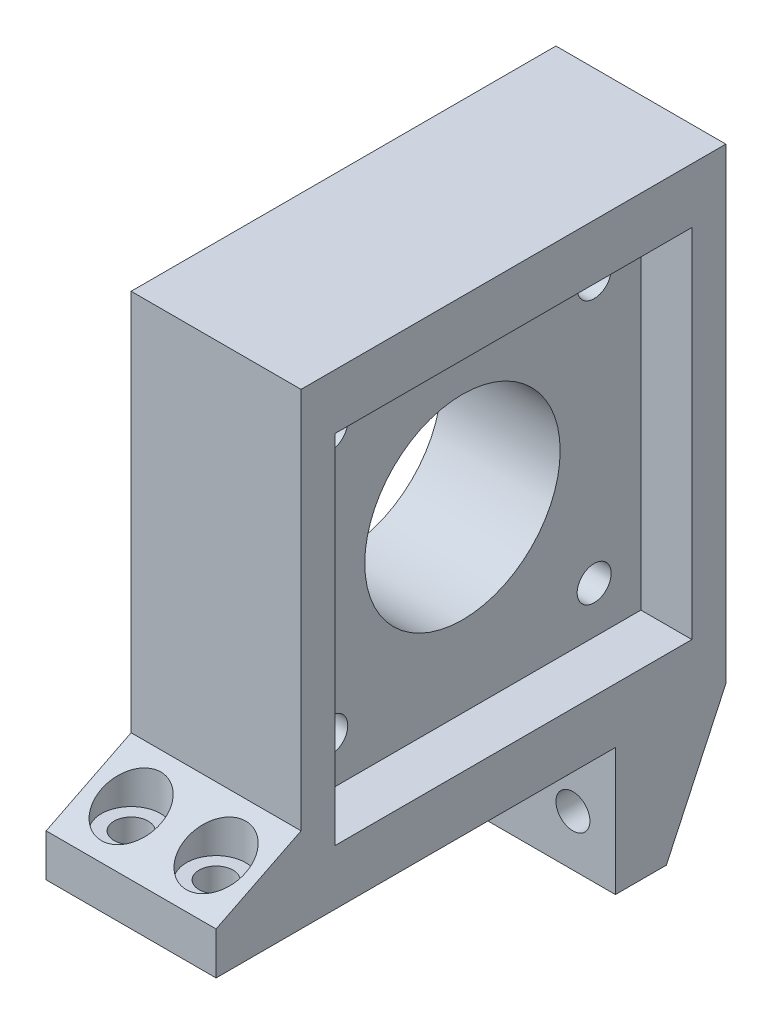
ISO-10303-21;
HEADER;
FILE_DESCRIPTION(('STEP AP214'),'2;1');
FILE_NAME('part.step','',(''),(''),'','','');
FILE_SCHEMA(('AUTOMOTIVE_DESIGN { 1 0 10303 214 1 1 1 1 }'));
ENDSEC;
DATA;
#1=APPLICATION_CONTEXT('core data for automotive mechanical design processes');
#2=APPLICATION_PROTOCOL_DEFINITION('international standard','automotive_design',2000,#1);
#3=PRODUCT_CONTEXT('',#1,'mechanical');
#4=PRODUCT('Part','Part','',(#3));
#5=PRODUCT_RELATED_PRODUCT_CATEGORY('part','',(#4));
#6=PRODUCT_DEFINITION_FORMATION('','',#4);
#7=PRODUCT_DEFINITION_CONTEXT('part definition',#1,'design');
#8=PRODUCT_DEFINITION('design','',#6,#7);
#9=PRODUCT_DEFINITION_SHAPE('','',#8);
#10=(LENGTH_UNIT() NAMED_UNIT(*) SI_UNIT(.MILLI.,.METRE.));
#11=(NAMED_UNIT(*) PLANE_ANGLE_UNIT() SI_UNIT($,.RADIAN.));
#12=(NAMED_UNIT(*) SI_UNIT($,.STERADIAN.) SOLID_ANGLE_UNIT());
#13=UNCERTAINTY_MEASURE_WITH_UNIT(LENGTH_MEASURE(1.E-05),#10,'distance_accuracy_value','');
#14=(GEOMETRIC_REPRESENTATION_CONTEXT(3) GLOBAL_UNCERTAINTY_ASSIGNED_CONTEXT((#13)) GLOBAL_UNIT_ASSIGNED_CONTEXT((#10,
#11,#12)) REPRESENTATION_CONTEXT('',''));
#15=CARTESIAN_POINT('',(0.,0.,0.));
#16=DIRECTION('',(0.,0.,1.));
#17=DIRECTION('',(1.,0.,0.));
#18=AXIS2_PLACEMENT_3D('',#15,#16,#17);
#19=CARTESIAN_POINT('',(-15.,25.,55.));
#20=DIRECTION('',(0.,-1.,0.));
#21=DIRECTION('',(0.,0.,-1.));
#22=AXIS2_PLACEMENT_3D('',#19,#20,#21);
#23=CYLINDRICAL_SURFACE('',#22,2.);
#24=CARTESIAN_POINT('',(-15.,15.,55.));
#25=DIRECTION('',(0.,-1.,0.));
#26=DIRECTION('',(0.,0.,-1.));
#27=AXIS2_PLACEMENT_3D('',#24,#25,#26);
#28=CIRCLE('',#27,2.);
#29=CARTESIAN_POINT('',(-15.,15.,53.));
#30=VERTEX_POINT('',#29);
#31=EDGE_CURVE('E232',#30,#30,#28,.T.);
#32=ORIENTED_EDGE('',*,*,#31,.T.);
#33=EDGE_LOOP('',(#32));
#34=FACE_BOUND('',#33,.T.);
#35=CARTESIAN_POINT('',(-15.,20.,55.));
#36=DIRECTION('',(0.,1.,0.));
#37=DIRECTION('',(0.,0.,1.));
#38=AXIS2_PLACEMENT_3D('',#35,#36,#37);
#39=CIRCLE('',#38,2.);
#40=CARTESIAN_POINT('',(-15.,20.,57.));
#41=VERTEX_POINT('',#40);
#42=EDGE_CURVE('E237',#41,#41,#39,.F.);
#43=ORIENTED_EDGE('',*,*,#42,.F.);
#44=EDGE_LOOP('',(#43));
#45=FACE_BOUND('',#44,.T.);
#46=ADVANCED_FACE('F39',(#34,#45),#23,.F.);
#47=CARTESIAN_POINT('',(-5.,25.,55.));
#48=DIRECTION('',(0.,-1.,0.));
#49=DIRECTION('',(0.,0.,-1.));
#50=AXIS2_PLACEMENT_3D('',#47,#48,#49);
#51=CYLINDRICAL_SURFACE('',#50,2.);
#52=CARTESIAN_POINT('',(-5.,15.,55.));
#53=DIRECTION('',(0.,-1.,0.));
#54=DIRECTION('',(0.,0.,-1.));
#55=AXIS2_PLACEMENT_3D('',#52,#53,#54);
#56=CIRCLE('',#55,2.);
#57=CARTESIAN_POINT('',(-5.,15.,53.));
#58=VERTEX_POINT('',#57);
#59=EDGE_CURVE('E261',#58,#58,#56,.T.);
#60=ORIENTED_EDGE('',*,*,#59,.T.);
#61=EDGE_LOOP('',(#60));
#62=FACE_BOUND('',#61,.T.);
#63=CARTESIAN_POINT('',(-5.,20.,55.));
#64=DIRECTION('',(0.,1.,0.));
#65=DIRECTION('',(0.,0.,1.));
#66=AXIS2_PLACEMENT_3D('',#63,#64,#65);
#67=CIRCLE('',#66,2.);
#68=CARTESIAN_POINT('',(-5.,20.,57.));
#69=VERTEX_POINT('',#68);
#70=EDGE_CURVE('E233',#69,#69,#67,.F.);
#71=ORIENTED_EDGE('',*,*,#70,.F.);
#72=EDGE_LOOP('',(#71));
#73=FACE_BOUND('',#72,.T.);
#74=ADVANCED_FACE('F423',(#62,#73),#51,.F.);
#75=CARTESIAN_POINT('',(-5.,6.,15.));
#76=DIRECTION('',(0.,0.,-1.));
#77=DIRECTION('',(-1.,0.,0.));
#78=AXIS2_PLACEMENT_3D('',#75,#76,#77);
#79=CYLINDRICAL_SURFACE('',#78,2.);
#80=CARTESIAN_POINT('',(-5.,6.,13.));
#81=DIRECTION('',(0.,0.,-1.));
#82=DIRECTION('',(-1.,0.,0.));
#83=AXIS2_PLACEMENT_3D('',#80,#81,#82);
#84=CIRCLE('',#83,2.);
#85=CARTESIAN_POINT('',(-7.,6.,13.));
#86=VERTEX_POINT('',#85);
#87=EDGE_CURVE('E199',#86,#86,#84,.T.);
#88=ORIENTED_EDGE('',*,*,#87,.F.);
#89=EDGE_LOOP('',(#88));
#90=FACE_BOUND('',#89,.T.);
#91=CARTESIAN_POINT('',(-5.,6.,8.));
#92=DIRECTION('',(0.,0.,-1.));
#93=DIRECTION('',(-1.,0.,0.));
#94=AXIS2_PLACEMENT_3D('',#91,#92,#93);
#95=CIRCLE('',#94,2.);
#96=CARTESIAN_POINT('',(-7.,6.,8.));
#97=VERTEX_POINT('',#96);
#98=EDGE_CURVE('E228',#97,#97,#95,.F.);
#99=ORIENTED_EDGE('',*,*,#98,.F.);
#100=EDGE_LOOP('',(#99));
#101=FACE_BOUND('',#100,.T.);
#102=ADVANCED_FACE('F429',(#90,#101),#79,.F.);
#103=CARTESIAN_POINT('',(-15.,6.,15.));
#104=DIRECTION('',(0.,0.,-1.));
#105=DIRECTION('',(-1.,0.,0.));
#106=AXIS2_PLACEMENT_3D('',#103,#104,#105);
#107=CYLINDRICAL_SURFACE('',#106,2.);
#108=CARTESIAN_POINT('',(-15.,6.,13.));
#109=DIRECTION('',(0.,0.,-1.));
#110=DIRECTION('',(-1.,0.,0.));
#111=AXIS2_PLACEMENT_3D('',#108,#109,#110);
#112=CIRCLE('',#111,2.);
#113=CARTESIAN_POINT('',(-17.,6.,13.));
#114=VERTEX_POINT('',#113);
#115=EDGE_CURVE('E203',#114,#114,#112,.T.);
#116=ORIENTED_EDGE('',*,*,#115,.F.);
#117=EDGE_LOOP('',(#116));
#118=FACE_BOUND('',#117,.T.);
#119=CARTESIAN_POINT('',(-15.,6.,8.));
#120=DIRECTION('',(0.,0.,-1.));
#121=DIRECTION('',(-1.,0.,0.));
#122=AXIS2_PLACEMENT_3D('',#119,#120,#121);
#123=CIRCLE('',#122,2.);
#124=CARTESIAN_POINT('',(-17.,6.,8.));
#125=VERTEX_POINT('',#124);
#126=EDGE_CURVE('E224',#125,#125,#123,.F.);
#127=ORIENTED_EDGE('',*,*,#126,.F.);
#128=EDGE_LOOP('',(#127));
#129=FACE_BOUND('',#128,.T.);
#130=ADVANCED_FACE('F543',(#118,#129),#107,.F.);
#131=CARTESIAN_POINT('',(0.,70.,50.));
#132=DIRECTION('',(0.,0.,-1.));
#133=DIRECTION('',(-1.,0.,0.));
#134=AXIS2_PLACEMENT_3D('',#131,#132,#133);
#135=PLANE('',#134);
#136=DIRECTION('',(0.,-1.,0.));
#137=VECTOR('',#136,1.);
#138=CARTESIAN_POINT('',(-20.,70.,50.));
#139=LINE('',#138,#137);
#140=CARTESIAN_POINT('',(-20.,70.,50.));
#141=VERTEX_POINT('',#140);
#142=CARTESIAN_POINT('',(-20.,25.,50.));
#143=VERTEX_POINT('',#142);
#144=EDGE_CURVE('E155',#141,#143,#139,.T.);
#145=ORIENTED_EDGE('',*,*,#144,.T.);
#146=DIRECTION('',(1.,0.,0.));
#147=VECTOR('',#146,1.);
#148=CARTESIAN_POINT('',(-20.,25.,50.));
#149=LINE('',#148,#147);
#150=CARTESIAN_POINT('',(0.,25.,50.));
#151=VERTEX_POINT('',#150);
#152=EDGE_CURVE('E135',#143,#151,#149,.T.);
#153=ORIENTED_EDGE('',*,*,#152,.T.);
#154=DIRECTION('',(0.,-1.,0.));
#155=VECTOR('',#154,1.);
#156=CARTESIAN_POINT('',(0.,70.,50.));
#157=LINE('',#156,#155);
#158=CARTESIAN_POINT('',(0.,70.,50.));
#159=VERTEX_POINT('',#158);
#160=EDGE_CURVE('E165',#159,#151,#157,.T.);
#161=ORIENTED_EDGE('',*,*,#160,.F.);
#162=DIRECTION('',(1.,0.,0.));
#163=VECTOR('',#162,1.);
#164=CARTESIAN_POINT('',(0.,70.,50.));
#165=LINE('',#164,#163);
#166=EDGE_CURVE('E162',#141,#159,#165,.T.);
#167=ORIENTED_EDGE('',*,*,#166,.F.);
#168=EDGE_LOOP('',(#145,#153,#161,#167));
#169=FACE_BOUND('',#168,.T.);
#170=ADVANCED_FACE('F161',(#169),#135,.F.);
#171=CARTESIAN_POINT('',(0.,70.,0.));
#172=DIRECTION('',(-1.,0.,0.));
#173=DIRECTION('',(0.,0.,1.));
#174=AXIS2_PLACEMENT_3D('',#171,#172,#173);
#175=PLANE('',#174);
#176=ORIENTED_EDGE('',*,*,#160,.T.);
#177=DIRECTION('',(0.,-0.447213595499958,0.894427190999916));
#178=VECTOR('',#177,1.);
#179=CARTESIAN_POINT('',(0.,20.,60.));
#180=LINE('',#179,#178);
#181=CARTESIAN_POINT('',(0.,20.,60.));
#182=VERTEX_POINT('',#181);
#183=EDGE_CURVE('E141',#151,#182,#180,.T.);
#184=ORIENTED_EDGE('',*,*,#183,.T.);
#185=DIRECTION('',(0.,1.,0.));
#186=VECTOR('',#185,1.);
#187=CARTESIAN_POINT('',(0.,15.,60.));
#188=LINE('',#187,#186);
#189=CARTESIAN_POINT('',(0.,15.,60.));
#190=VERTEX_POINT('',#189);
#191=EDGE_CURVE('E147',#190,#182,#188,.T.);
#192=ORIENTED_EDGE('',*,*,#191,.F.);
#193=DIRECTION('',(0.,0.,1.));
#194=VECTOR('',#193,1.);
#195=CARTESIAN_POINT('',(0.,15.,50.));
#196=LINE('',#195,#194);
#197=CARTESIAN_POINT('',(0.,15.,13.));
#198=VERTEX_POINT('',#197);
#199=EDGE_CURVE('E352',#198,#190,#196,.T.);
#200=ORIENTED_EDGE('',*,*,#199,.F.);
#201=DIRECTION('',(0.,1.,0.));
#202=VECTOR('',#201,1.);
#203=CARTESIAN_POINT('',(0.,0.,13.));
#204=LINE('',#203,#202);
#205=CARTESIAN_POINT('',(0.,0.,13.));
#206=VERTEX_POINT('',#205);
#207=EDGE_CURVE('E208',#206,#198,#204,.T.);
#208=ORIENTED_EDGE('',*,*,#207,.F.);
#209=DIRECTION('',(0.,0.,-1.));
#210=VECTOR('',#209,1.);
#211=CARTESIAN_POINT('',(0.,0.,0.));
#212=LINE('',#211,#210);
#213=CARTESIAN_POINT('',(0.,0.,7.));
#214=VERTEX_POINT('',#213);
#215=EDGE_CURVE('E197',#206,#214,#212,.T.);
#216=ORIENTED_EDGE('',*,*,#215,.T.);
#217=DIRECTION('',(0.,-0.906183139995266,0.422885465331124));
#218=VECTOR('',#217,1.);
#219=CARTESIAN_POINT('',(0.,15.,0.));
#220=LINE('',#219,#218);
#221=CARTESIAN_POINT('',(0.,15.,0.));
#222=VERTEX_POINT('',#221);
#223=EDGE_CURVE('E57',#222,#214,#220,.T.);
#224=ORIENTED_EDGE('',*,*,#223,.F.);
#225=DIRECTION('',(0.,-1.,0.));
#226=VECTOR('',#225,1.);
#227=CARTESIAN_POINT('',(0.,70.,0.));
#228=LINE('',#227,#226);
#229=CARTESIAN_POINT('',(0.,70.,0.));
#230=VERTEX_POINT('',#229);
#231=EDGE_CURVE('E49',#230,#222,#228,.T.);
#232=ORIENTED_EDGE('',*,*,#231,.F.);
#233=DIRECTION('',(0.,0.,-1.));
#234=VECTOR('',#233,1.);
#235=CARTESIAN_POINT('',(0.,70.,0.));
#236=LINE('',#235,#234);
#237=EDGE_CURVE('E364',#159,#230,#236,.T.);
#238=ORIENTED_EDGE('',*,*,#237,.F.);
#239=EDGE_LOOP('',(#176,#184,#192,#200,#208,#216,#224,#232,#238));
#240=FACE_BOUND('',#239,.T.);
#241=DIRECTION('',(0.,0.,1.));
#242=VECTOR('',#241,1.);
#243=CARTESIAN_POINT('',(0.,63.5,4.));
#244=LINE('',#243,#242);
#245=CARTESIAN_POINT('',(0.,63.5,4.));
#246=VERTEX_POINT('',#245);
#247=CARTESIAN_POINT('',(0.,63.5,46.));
#248=VERTEX_POINT('',#247);
#249=EDGE_CURVE('E314',#246,#248,#244,.T.);
#250=ORIENTED_EDGE('',*,*,#249,.F.);
#251=DIRECTION('',(0.,1.,0.));
#252=VECTOR('',#251,1.);
#253=CARTESIAN_POINT('',(0.,63.5,4.));
#254=LINE('',#253,#252);
#255=CARTESIAN_POINT('',(0.,21.5,3.99999999999999));
#256=VERTEX_POINT('',#255);
#257=EDGE_CURVE('E65',#256,#246,#254,.T.);
#258=ORIENTED_EDGE('',*,*,#257,.F.);
#259=DIRECTION('',(0.,0.,-1.));
#260=VECTOR('',#259,1.);
#261=CARTESIAN_POINT('',(0.,21.5,3.99999999999999));
#262=LINE('',#261,#260);
#263=CARTESIAN_POINT('',(0.,21.5,46.));
#264=VERTEX_POINT('',#263);
#265=EDGE_CURVE('E299',#264,#256,#262,.T.);
#266=ORIENTED_EDGE('',*,*,#265,.F.);
#267=DIRECTION('',(0.,-1.,0.));
#268=VECTOR('',#267,1.);
#269=CARTESIAN_POINT('',(0.,63.5,46.));
#270=LINE('',#269,#268);
#271=EDGE_CURVE('E318',#248,#264,#270,.T.);
#272=ORIENTED_EDGE('',*,*,#271,.F.);
#273=EDGE_LOOP('',(#250,#258,#266,#272));
#274=FACE_BOUND('',#273,.T.);
#275=ADVANCED_FACE('F41',(#240,#274),#175,.F.);
#276=CARTESIAN_POINT('',(0.,70.,0.));
#277=DIRECTION('',(0.,0.,1.));
#278=DIRECTION('',(1.,0.,0.));
#279=AXIS2_PLACEMENT_3D('',#276,#277,#278);
#280=PLANE('',#279);
#281=ORIENTED_EDGE('',*,*,#231,.T.);
#282=DIRECTION('',(1.,0.,0.));
#283=VECTOR('',#282,1.);
#284=CARTESIAN_POINT('',(-30.,15.,0.));
#285=LINE('',#284,#283);
#286=CARTESIAN_POINT('',(-20.,15.,0.));
#287=VERTEX_POINT('',#286);
#288=EDGE_CURVE('E285',#287,#222,#285,.T.);
#289=ORIENTED_EDGE('',*,*,#288,.F.);
#290=DIRECTION('',(0.,-1.,0.));
#291=VECTOR('',#290,1.);
#292=CARTESIAN_POINT('',(-20.,70.,0.));
#293=LINE('',#292,#291);
#294=CARTESIAN_POINT('',(-20.,70.,0.));
#295=VERTEX_POINT('',#294);
#296=EDGE_CURVE('E164',#295,#287,#293,.T.);
#297=ORIENTED_EDGE('',*,*,#296,.F.);
#298=DIRECTION('',(-1.,0.,0.));
#299=VECTOR('',#298,1.);
#300=CARTESIAN_POINT('',(0.,70.,0.));
#301=LINE('',#300,#299);
#302=EDGE_CURVE('E368',#230,#295,#301,.T.);
#303=ORIENTED_EDGE('',*,*,#302,.F.);
#304=EDGE_LOOP('',(#281,#289,#297,#303));
#305=FACE_BOUND('',#304,.T.);
#306=ADVANCED_FACE('F406',(#305),#280,.F.);
#307=CARTESIAN_POINT('',(-20.,70.,0.));
#308=DIRECTION('',(1.,0.,0.));
#309=DIRECTION('',(0.,0.,-1.));
#310=AXIS2_PLACEMENT_3D('',#307,#308,#309);
#311=PLANE('',#310);
#312=DIRECTION('',(0.,-0.447213595499958,0.894427190999916));
#313=VECTOR('',#312,1.);
#314=CARTESIAN_POINT('',(-20.,20.,60.));
#315=LINE('',#314,#313);
#316=CARTESIAN_POINT('',(-20.,20.,60.));
#317=VERTEX_POINT('',#316);
#318=EDGE_CURVE('E138',#143,#317,#315,.T.);
#319=ORIENTED_EDGE('',*,*,#318,.F.);
#320=ORIENTED_EDGE('',*,*,#144,.F.);
#321=DIRECTION('',(0.,0.,1.));
#322=VECTOR('',#321,1.);
#323=CARTESIAN_POINT('',(-20.,70.,0.));
#324=LINE('',#323,#322);
#325=EDGE_CURVE('E372',#295,#141,#324,.T.);
#326=ORIENTED_EDGE('',*,*,#325,.F.);
#327=ORIENTED_EDGE('',*,*,#296,.T.);
#328=DIRECTION('',(0.,-0.906183139995266,0.422885465331124));
#329=VECTOR('',#328,1.);
#330=CARTESIAN_POINT('',(-20.,60.1642335766424,-21.0766423357664));
#331=LINE('',#330,#329);
#332=CARTESIAN_POINT('',(-20.,0.,7.));
#333=VERTEX_POINT('',#332);
#334=EDGE_CURVE('E288',#287,#333,#331,.T.);
#335=ORIENTED_EDGE('',*,*,#334,.T.);
#336=DIRECTION('',(0.,0.,1.));
#337=VECTOR('',#336,1.);
#338=CARTESIAN_POINT('',(-20.,0.,0.));
#339=LINE('',#338,#337);
#340=CARTESIAN_POINT('',(-20.,0.,13.));
#341=VERTEX_POINT('',#340);
#342=EDGE_CURVE('E369',#333,#341,#339,.T.);
#343=ORIENTED_EDGE('',*,*,#342,.T.);
#344=DIRECTION('',(0.,1.,0.));
#345=VECTOR('',#344,1.);
#346=CARTESIAN_POINT('',(-20.,70.,13.));
#347=LINE('',#346,#345);
#348=CARTESIAN_POINT('',(-20.,15.,13.));
#349=VERTEX_POINT('',#348);
#350=EDGE_CURVE('E358',#341,#349,#347,.T.);
#351=ORIENTED_EDGE('',*,*,#350,.T.);
#352=DIRECTION('',(0.,0.,1.));
#353=VECTOR('',#352,1.);
#354=CARTESIAN_POINT('',(-20.,15.,0.));
#355=LINE('',#354,#353);
#356=CARTESIAN_POINT('',(-20.,15.,60.));
#357=VERTEX_POINT('',#356);
#358=EDGE_CURVE('E182',#349,#357,#355,.T.);
#359=ORIENTED_EDGE('',*,*,#358,.T.);
#360=DIRECTION('',(0.,-1.,0.));
#361=VECTOR('',#360,1.);
#362=CARTESIAN_POINT('',(-20.,15.,60.));
#363=LINE('',#362,#361);
#364=EDGE_CURVE('E158',#317,#357,#363,.T.);
#365=ORIENTED_EDGE('',*,*,#364,.F.);
#366=EDGE_LOOP('',(#319,#320,#326,#327,#335,#343,#351,#359,#365));
#367=FACE_BOUND('',#366,.T.);
#368=CARTESIAN_POINT('',(-20.,42.5,25.));
#369=DIRECTION('',(1.,0.,0.));
#370=DIRECTION('',(0.,0.,-1.));
#371=AXIS2_PLACEMENT_3D('',#368,#369,#370);
#372=CIRCLE('',#371,11.5);
#373=CARTESIAN_POINT('',(-20.,42.5,13.5));
#374=VERTEX_POINT('',#373);
#375=EDGE_CURVE('E194',#374,#374,#372,.T.);
#376=ORIENTED_EDGE('',*,*,#375,.T.);
#377=EDGE_LOOP('',(#376));
#378=FACE_BOUND('',#377,.T.);
#379=CARTESIAN_POINT('',(-20.,58.,40.5));
#380=DIRECTION('',(1.,0.,0.));
#381=DIRECTION('',(0.,0.,-1.));
#382=AXIS2_PLACEMENT_3D('',#379,#380,#381);
#383=CIRCLE('',#382,2.00000000000001);
#384=CARTESIAN_POINT('',(-20.,58.,38.5));
#385=VERTEX_POINT('',#384);
#386=EDGE_CURVE('E190',#385,#385,#383,.T.);
#387=ORIENTED_EDGE('',*,*,#386,.T.);
#388=EDGE_LOOP('',(#387));
#389=FACE_BOUND('',#388,.T.);
#390=CARTESIAN_POINT('',(-20.,27.,40.5));
#391=DIRECTION('',(1.,0.,0.));
#392=DIRECTION('',(0.,0.,-1.));
#393=AXIS2_PLACEMENT_3D('',#390,#391,#392);
#394=CIRCLE('',#393,2.);
#395=CARTESIAN_POINT('',(-20.,27.,38.5));
#396=VERTEX_POINT('',#395);
#397=EDGE_CURVE('E186',#396,#396,#394,.T.);
#398=ORIENTED_EDGE('',*,*,#397,.T.);
#399=EDGE_LOOP('',(#398));
#400=FACE_BOUND('',#399,.T.);
#401=CARTESIAN_POINT('',(-20.,27.,9.5));
#402=DIRECTION('',(1.,0.,0.));
#403=DIRECTION('',(0.,0.,-1.));
#404=AXIS2_PLACEMENT_3D('',#401,#402,#403);
#405=CIRCLE('',#404,2.00000000000001);
#406=CARTESIAN_POINT('',(-20.,27.,7.49999999999999));
#407=VERTEX_POINT('',#406);
#408=EDGE_CURVE('E181',#407,#407,#405,.T.);
#409=ORIENTED_EDGE('',*,*,#408,.T.);
#410=EDGE_LOOP('',(#409));
#411=FACE_BOUND('',#410,.T.);
#412=CARTESIAN_POINT('',(-20.,58.,9.5));
#413=DIRECTION('',(1.,0.,0.));
#414=DIRECTION('',(0.,0.,-1.));
#415=AXIS2_PLACEMENT_3D('',#412,#413,#414);
#416=CIRCLE('',#415,2.00000000000001);
#417=CARTESIAN_POINT('',(-20.,58.,7.5));
#418=VERTEX_POINT('',#417);
#419=EDGE_CURVE('E177',#418,#418,#416,.T.);
#420=ORIENTED_EDGE('',*,*,#419,.T.);
#421=EDGE_LOOP('',(#420));
#422=FACE_BOUND('',#421,.T.);
#423=ADVANCED_FACE('F152',(#367,#378,#389,#400,#411,#422),#311,.F.);
#424=CARTESIAN_POINT('',(0.,70.,0.));
#425=DIRECTION('',(0.,-1.,0.));
#426=DIRECTION('',(0.,0.,-1.));
#427=AXIS2_PLACEMENT_3D('',#424,#425,#426);
#428=PLANE('',#427);
#429=ORIENTED_EDGE('',*,*,#237,.T.);
#430=ORIENTED_EDGE('',*,*,#302,.T.);
#431=ORIENTED_EDGE('',*,*,#325,.T.);
#432=ORIENTED_EDGE('',*,*,#166,.T.);
#433=EDGE_LOOP('',(#429,#430,#431,#432));
#434=FACE_BOUND('',#433,.T.);
#435=ADVANCED_FACE('F402',(#434),#428,.F.);
#436=CARTESIAN_POINT('',(0.,0.,0.));
#437=DIRECTION('',(0.,-1.,0.));
#438=DIRECTION('',(0.,0.,-1.));
#439=AXIS2_PLACEMENT_3D('',#436,#437,#438);
#440=PLANE('',#439);
#441=DIRECTION('',(1.,0.,0.));
#442=VECTOR('',#441,1.);
#443=CARTESIAN_POINT('',(-30.,0.,7.));
#444=LINE('',#443,#442);
#445=EDGE_CURVE('E284',#333,#214,#444,.T.);
#446=ORIENTED_EDGE('',*,*,#445,.T.);
#447=ORIENTED_EDGE('',*,*,#215,.F.);
#448=DIRECTION('',(1.,0.,0.));
#449=VECTOR('',#448,1.);
#450=CARTESIAN_POINT('',(0.,0.,13.));
#451=LINE('',#450,#449);
#452=EDGE_CURVE('E11',#341,#206,#451,.T.);
#453=ORIENTED_EDGE('',*,*,#452,.F.);
#454=ORIENTED_EDGE('',*,*,#342,.F.);
#455=EDGE_LOOP('',(#446,#447,#453,#454));
#456=FACE_BOUND('',#455,.T.);
#457=ADVANCED_FACE('F389',(#456),#440,.T.);
#458=CARTESIAN_POINT('',(-60.,58.,9.50000000000001));
#459=DIRECTION('',(1.,0.,0.));
#460=DIRECTION('',(0.,0.,-1.));
#461=AXIS2_PLACEMENT_3D('',#458,#459,#460);
#462=CYLINDRICAL_SURFACE('',#461,2.00000000000001);
#463=CARTESIAN_POINT('',(-6.,58.,9.5));
#464=DIRECTION('',(-1.,0.,0.));
#465=DIRECTION('',(0.,0.,1.));
#466=AXIS2_PLACEMENT_3D('',#463,#464,#465);
#467=CIRCLE('',#466,2.00000000000001);
#468=CARTESIAN_POINT('',(-6.,58.,11.5));
#469=VERTEX_POINT('',#468);
#470=EDGE_CURVE('E204',#469,#469,#467,.F.);
#471=ORIENTED_EDGE('',*,*,#470,.T.);
#472=EDGE_LOOP('',(#471));
#473=FACE_BOUND('',#472,.T.);
#474=ORIENTED_EDGE('',*,*,#419,.F.);
#475=EDGE_LOOP('',(#474));
#476=FACE_BOUND('',#475,.T.);
#477=ADVANCED_FACE('F660',(#473,#476),#462,.F.);
#478=CARTESIAN_POINT('',(-60.,27.,9.50000000000001));
#479=DIRECTION('',(1.,0.,0.));
#480=DIRECTION('',(0.,0.,-1.));
#481=AXIS2_PLACEMENT_3D('',#478,#479,#480);
#482=CYLINDRICAL_SURFACE('',#481,2.00000000000001);
#483=CARTESIAN_POINT('',(-6.,27.,9.5));
#484=DIRECTION('',(-1.,0.,0.));
#485=DIRECTION('',(0.,0.,1.));
#486=AXIS2_PLACEMENT_3D('',#483,#484,#485);
#487=CIRCLE('',#486,2.00000000000001);
#488=CARTESIAN_POINT('',(-6.,27.,11.5));
#489=VERTEX_POINT('',#488);
#490=EDGE_CURVE('E342',#489,#489,#487,.F.);
#491=ORIENTED_EDGE('',*,*,#490,.T.);
#492=EDGE_LOOP('',(#491));
#493=FACE_BOUND('',#492,.T.);
#494=ORIENTED_EDGE('',*,*,#408,.F.);
#495=EDGE_LOOP('',(#494));
#496=FACE_BOUND('',#495,.T.);
#497=ADVANCED_FACE('F685',(#493,#496),#482,.F.);
#498=CARTESIAN_POINT('',(-60.,27.,40.5));
#499=DIRECTION('',(1.,0.,0.));
#500=DIRECTION('',(0.,0.,-1.));
#501=AXIS2_PLACEMENT_3D('',#498,#499,#500);
#502=CYLINDRICAL_SURFACE('',#501,2.);
#503=CARTESIAN_POINT('',(-5.99999999999999,27.,40.5));
#504=DIRECTION('',(-1.,0.,0.));
#505=DIRECTION('',(0.,0.,1.));
#506=AXIS2_PLACEMENT_3D('',#503,#504,#505);
#507=CIRCLE('',#506,2.);
#508=CARTESIAN_POINT('',(-5.99999999999999,27.,42.5));
#509=VERTEX_POINT('',#508);
#510=EDGE_CURVE('E338',#509,#509,#507,.F.);
#511=ORIENTED_EDGE('',*,*,#510,.T.);
#512=EDGE_LOOP('',(#511));
#513=FACE_BOUND('',#512,.T.);
#514=ORIENTED_EDGE('',*,*,#397,.F.);
#515=EDGE_LOOP('',(#514));
#516=FACE_BOUND('',#515,.T.);
#517=ADVANCED_FACE('F691',(#513,#516),#502,.F.);
#518=CARTESIAN_POINT('',(-60.,58.,40.5));
#519=DIRECTION('',(1.,0.,0.));
#520=DIRECTION('',(0.,0.,-1.));
#521=AXIS2_PLACEMENT_3D('',#518,#519,#520);
#522=CYLINDRICAL_SURFACE('',#521,2.00000000000001);
#523=CARTESIAN_POINT('',(-5.99999999999999,58.,40.5));
#524=DIRECTION('',(-1.,0.,0.));
#525=DIRECTION('',(0.,0.,1.));
#526=AXIS2_PLACEMENT_3D('',#523,#524,#525);
#527=CIRCLE('',#526,2.00000000000001);
#528=CARTESIAN_POINT('',(-5.99999999999999,58.,42.5));
#529=VERTEX_POINT('',#528);
#530=EDGE_CURVE('E213',#529,#529,#527,.F.);
#531=ORIENTED_EDGE('',*,*,#530,.T.);
#532=EDGE_LOOP('',(#531));
#533=FACE_BOUND('',#532,.T.);
#534=ORIENTED_EDGE('',*,*,#386,.F.);
#535=EDGE_LOOP('',(#534));
#536=FACE_BOUND('',#535,.T.);
#537=ADVANCED_FACE('F688',(#533,#536),#522,.F.);
#538=CARTESIAN_POINT('',(-60.,42.5,25.));
#539=DIRECTION('',(1.,0.,0.));
#540=DIRECTION('',(0.,0.,-1.));
#541=AXIS2_PLACEMENT_3D('',#538,#539,#540);
#542=CYLINDRICAL_SURFACE('',#541,11.5);
#543=CARTESIAN_POINT('',(-6.,42.5,25.));
#544=DIRECTION('',(-1.,0.,0.));
#545=DIRECTION('',(0.,0.,1.));
#546=AXIS2_PLACEMENT_3D('',#543,#544,#545);
#547=CIRCLE('',#546,11.5);
#548=CARTESIAN_POINT('',(-6.,42.5,36.5));
#549=VERTEX_POINT('',#548);
#550=EDGE_CURVE('E209',#549,#549,#547,.F.);
#551=ORIENTED_EDGE('',*,*,#550,.T.);
#552=EDGE_LOOP('',(#551));
#553=FACE_BOUND('',#552,.T.);
#554=ORIENTED_EDGE('',*,*,#375,.F.);
#555=EDGE_LOOP('',(#554));
#556=FACE_BOUND('',#555,.T.);
#557=ADVANCED_FACE('F592',(#553,#556),#542,.F.);
#558=CARTESIAN_POINT('',(-60.,15.,50.));
#559=DIRECTION('',(0.,1.,0.));
#560=DIRECTION('',(0.,0.,1.));
#561=AXIS2_PLACEMENT_3D('',#558,#559,#560);
#562=PLANE('',#561);
#563=ORIENTED_EDGE('',*,*,#59,.F.);
#564=EDGE_LOOP('',(#563));
#565=FACE_BOUND('',#564,.T.);
#566=ORIENTED_EDGE('',*,*,#31,.F.);
#567=EDGE_LOOP('',(#566));
#568=FACE_BOUND('',#567,.T.);
#569=DIRECTION('',(1.,0.,0.));
#570=VECTOR('',#569,1.);
#571=CARTESIAN_POINT('',(-60.,15.,13.));
#572=LINE('',#571,#570);
#573=EDGE_CURVE('E355',#349,#198,#572,.T.);
#574=ORIENTED_EDGE('',*,*,#573,.T.);
#575=ORIENTED_EDGE('',*,*,#199,.T.);
#576=DIRECTION('',(1.,0.,0.));
#577=VECTOR('',#576,1.);
#578=CARTESIAN_POINT('',(0.,15.,60.));
#579=LINE('',#578,#577);
#580=EDGE_CURVE('E278',#357,#190,#579,.T.);
#581=ORIENTED_EDGE('',*,*,#580,.F.);
#582=ORIENTED_EDGE('',*,*,#358,.F.);
#583=EDGE_LOOP('',(#574,#575,#581,#582));
#584=FACE_BOUND('',#583,.T.);
#585=ADVANCED_FACE('F397',(#565,#568,#584),#562,.F.);
#586=CARTESIAN_POINT('',(-60.,0.,13.));
#587=DIRECTION('',(0.,0.,-1.));
#588=DIRECTION('',(-1.,0.,0.));
#589=AXIS2_PLACEMENT_3D('',#586,#587,#588);
#590=PLANE('',#589);
#591=ORIENTED_EDGE('',*,*,#115,.T.);
#592=EDGE_LOOP('',(#591));
#593=FACE_BOUND('',#592,.T.);
#594=ORIENTED_EDGE('',*,*,#87,.T.);
#595=EDGE_LOOP('',(#594));
#596=FACE_BOUND('',#595,.T.);
#597=ORIENTED_EDGE('',*,*,#452,.T.);
#598=ORIENTED_EDGE('',*,*,#207,.T.);
#599=ORIENTED_EDGE('',*,*,#573,.F.);
#600=ORIENTED_EDGE('',*,*,#350,.F.);
#601=EDGE_LOOP('',(#597,#598,#599,#600));
#602=FACE_BOUND('',#601,.T.);
#603=ADVANCED_FACE('F386',(#593,#596,#602),#590,.F.);
#604=CARTESIAN_POINT('',(-6.,0.,0.));
#605=DIRECTION('',(-1.,0.,0.));
#606=DIRECTION('',(0.,0.,1.));
#607=AXIS2_PLACEMENT_3D('',#604,#605,#606);
#608=PLANE('',#607);
#609=ORIENTED_EDGE('',*,*,#490,.F.);
#610=EDGE_LOOP('',(#609));
#611=FACE_BOUND('',#610,.T.);
#612=ORIENTED_EDGE('',*,*,#530,.F.);
#613=EDGE_LOOP('',(#612));
#614=FACE_BOUND('',#613,.T.);
#615=DIRECTION('',(0.,1.,0.));
#616=VECTOR('',#615,1.);
#617=CARTESIAN_POINT('',(-6.,63.5,4.));
#618=LINE('',#617,#616);
#619=CARTESIAN_POINT('',(-6.,21.5,3.99999999999999));
#620=VERTEX_POINT('',#619);
#621=CARTESIAN_POINT('',(-6.,63.5,4.));
#622=VERTEX_POINT('',#621);
#623=EDGE_CURVE('E294',#620,#622,#618,.T.);
#624=ORIENTED_EDGE('',*,*,#623,.T.);
#625=DIRECTION('',(0.,0.,1.));
#626=VECTOR('',#625,1.);
#627=CARTESIAN_POINT('',(-6.,63.5,4.));
#628=LINE('',#627,#626);
#629=CARTESIAN_POINT('',(-5.99999999999999,63.5,46.));
#630=VERTEX_POINT('',#629);
#631=EDGE_CURVE('E298',#622,#630,#628,.T.);
#632=ORIENTED_EDGE('',*,*,#631,.T.);
#633=DIRECTION('',(0.,-1.,0.));
#634=VECTOR('',#633,1.);
#635=CARTESIAN_POINT('',(-5.99999999999999,63.5,46.));
#636=LINE('',#635,#634);
#637=CARTESIAN_POINT('',(-5.99999999999999,21.5,46.));
#638=VERTEX_POINT('',#637);
#639=EDGE_CURVE('E303',#630,#638,#636,.T.);
#640=ORIENTED_EDGE('',*,*,#639,.T.);
#641=DIRECTION('',(0.,0.,-1.));
#642=VECTOR('',#641,1.);
#643=CARTESIAN_POINT('',(-6.,21.5,3.99999999999999));
#644=LINE('',#643,#642);
#645=EDGE_CURVE('E307',#638,#620,#644,.T.);
#646=ORIENTED_EDGE('',*,*,#645,.T.);
#647=EDGE_LOOP('',(#624,#632,#640,#646));
#648=FACE_BOUND('',#647,.T.);
#649=ORIENTED_EDGE('',*,*,#550,.F.);
#650=EDGE_LOOP('',(#649));
#651=FACE_BOUND('',#650,.T.);
#652=ORIENTED_EDGE('',*,*,#510,.F.);
#653=EDGE_LOOP('',(#652));
#654=FACE_BOUND('',#653,.T.);
#655=ORIENTED_EDGE('',*,*,#470,.F.);
#656=EDGE_LOOP('',(#655));
#657=FACE_BOUND('',#656,.T.);
#658=ADVANCED_FACE('F609',(#611,#614,#648,#651,#654,#657),#608,.F.);
#659=CARTESIAN_POINT('',(-6.,63.5,4.));
#660=DIRECTION('',(0.,0.,-1.));
#661=DIRECTION('',(0.,1.,0.));
#662=AXIS2_PLACEMENT_3D('',#659,#660,#661);
#663=PLANE('',#662);
#664=ORIENTED_EDGE('',*,*,#257,.T.);
#665=DIRECTION('',(1.,0.,0.));
#666=VECTOR('',#665,1.);
#667=CARTESIAN_POINT('',(-6.,63.5,4.));
#668=LINE('',#667,#666);
#669=EDGE_CURVE('E311',#622,#246,#668,.T.);
#670=ORIENTED_EDGE('',*,*,#669,.F.);
#671=ORIENTED_EDGE('',*,*,#623,.F.);
#672=DIRECTION('',(1.,0.,0.));
#673=VECTOR('',#672,1.);
#674=CARTESIAN_POINT('',(-6.,21.5,3.99999999999999));
#675=LINE('',#674,#673);
#676=EDGE_CURVE('E214',#620,#256,#675,.T.);
#677=ORIENTED_EDGE('',*,*,#676,.T.);
#678=EDGE_LOOP('',(#664,#670,#671,#677));
#679=FACE_BOUND('',#678,.T.);
#680=ADVANCED_FACE('F618',(#679),#663,.F.);
#681=CARTESIAN_POINT('',(-6.,21.5,3.99999999999999));
#682=DIRECTION('',(0.,-1.,0.));
#683=DIRECTION('',(0.,0.,-1.));
#684=AXIS2_PLACEMENT_3D('',#681,#682,#683);
#685=PLANE('',#684);
#686=ORIENTED_EDGE('',*,*,#265,.T.);
#687=ORIENTED_EDGE('',*,*,#676,.F.);
#688=ORIENTED_EDGE('',*,*,#645,.F.);
#689=DIRECTION('',(1.,0.,0.));
#690=VECTOR('',#689,1.);
#691=CARTESIAN_POINT('',(-5.99999999999999,21.5,46.));
#692=LINE('',#691,#690);
#693=EDGE_CURVE('E327',#638,#264,#692,.T.);
#694=ORIENTED_EDGE('',*,*,#693,.T.);
#695=EDGE_LOOP('',(#686,#687,#688,#694));
#696=FACE_BOUND('',#695,.T.);
#697=ADVANCED_FACE('F625',(#696),#685,.F.);
#698=CARTESIAN_POINT('',(-5.99999999999999,63.5,46.));
#699=DIRECTION('',(0.,0.,1.));
#700=DIRECTION('',(0.,-1.,0.));
#701=AXIS2_PLACEMENT_3D('',#698,#699,#700);
#702=PLANE('',#701);
#703=ORIENTED_EDGE('',*,*,#271,.T.);
#704=ORIENTED_EDGE('',*,*,#693,.F.);
#705=ORIENTED_EDGE('',*,*,#639,.F.);
#706=DIRECTION('',(1.,0.,0.));
#707=VECTOR('',#706,1.);
#708=CARTESIAN_POINT('',(-5.99999999999999,63.5,46.));
#709=LINE('',#708,#707);
#710=EDGE_CURVE('E330',#630,#248,#709,.T.);
#711=ORIENTED_EDGE('',*,*,#710,.T.);
#712=EDGE_LOOP('',(#703,#704,#705,#711));
#713=FACE_BOUND('',#712,.T.);
#714=ADVANCED_FACE('F417',(#713),#702,.F.);
#715=CARTESIAN_POINT('',(-6.,63.5,4.));
#716=DIRECTION('',(0.,1.,0.));
#717=DIRECTION('',(0.,0.,1.));
#718=AXIS2_PLACEMENT_3D('',#715,#716,#717);
#719=PLANE('',#718);
#720=ORIENTED_EDGE('',*,*,#249,.T.);
#721=ORIENTED_EDGE('',*,*,#710,.F.);
#722=ORIENTED_EDGE('',*,*,#631,.F.);
#723=ORIENTED_EDGE('',*,*,#669,.T.);
#724=EDGE_LOOP('',(#720,#721,#722,#723));
#725=FACE_BOUND('',#724,.T.);
#726=ADVANCED_FACE('F409',(#725),#719,.F.);
#727=CARTESIAN_POINT('',(-30.,15.,0.));
#728=DIRECTION('',(0.,0.422885465331124,0.906183139995266));
#729=DIRECTION('',(0.,-0.906183139995266,0.422885465331124));
#730=AXIS2_PLACEMENT_3D('',#727,#728,#729);
#731=PLANE('',#730);
#732=CARTESIAN_POINT('',(-15.,6.,4.2));
#733=DIRECTION('',(0.,0.422885465331124,0.906183139995266));
#734=DIRECTION('',(0.,0.906183139995266,-0.422885465331124));
#735=AXIS2_PLACEMENT_3D('',#732,#733,#734);
#736=ELLIPSE('',#735,3.86235391669093,3.5);
#737=CARTESIAN_POINT('',(-15.,9.5,2.56666666666667));
#738=VERTEX_POINT('',#737);
#739=EDGE_CURVE('E219',#738,#738,#736,.T.);
#740=ORIENTED_EDGE('',*,*,#739,.T.);
#741=EDGE_LOOP('',(#740));
#742=FACE_BOUND('',#741,.T.);
#743=CARTESIAN_POINT('',(-5.,6.,4.2));
#744=DIRECTION('',(0.,0.422885465331124,0.906183139995266));
#745=DIRECTION('',(0.,0.906183139995266,-0.422885465331124));
#746=AXIS2_PLACEMENT_3D('',#743,#744,#745);
#747=ELLIPSE('',#746,3.86235391669093,3.5);
#748=CARTESIAN_POINT('',(-5.,9.5,2.56666666666667));
#749=VERTEX_POINT('',#748);
#750=EDGE_CURVE('E215',#749,#749,#747,.T.);
#751=ORIENTED_EDGE('',*,*,#750,.T.);
#752=EDGE_LOOP('',(#751));
#753=FACE_BOUND('',#752,.T.);
#754=ORIENTED_EDGE('',*,*,#288,.T.);
#755=ORIENTED_EDGE('',*,*,#223,.T.);
#756=ORIENTED_EDGE('',*,*,#445,.F.);
#757=ORIENTED_EDGE('',*,*,#334,.F.);
#758=EDGE_LOOP('',(#754,#755,#756,#757));
#759=FACE_BOUND('',#758,.T.);
#760=ADVANCED_FACE('F407',(#742,#753,#759),#731,.F.);
#761=CARTESIAN_POINT('',(0.,0.,60.));
#762=DIRECTION('',(0.,0.,1.));
#763=DIRECTION('',(1.,0.,0.));
#764=AXIS2_PLACEMENT_3D('',#761,#762,#763);
#765=PLANE('',#764);
#766=ORIENTED_EDGE('',*,*,#191,.T.);
#767=DIRECTION('',(-1.,0.,0.));
#768=VECTOR('',#767,1.);
#769=CARTESIAN_POINT('',(0.,20.,60.));
#770=LINE('',#769,#768);
#771=EDGE_CURVE('E273',#182,#317,#770,.T.);
#772=ORIENTED_EDGE('',*,*,#771,.T.);
#773=ORIENTED_EDGE('',*,*,#364,.T.);
#774=ORIENTED_EDGE('',*,*,#580,.T.);
#775=EDGE_LOOP('',(#766,#772,#773,#774));
#776=FACE_BOUND('',#775,.T.);
#777=ADVANCED_FACE('F399',(#776),#765,.T.);
#778=CARTESIAN_POINT('',(-20.,20.,60.));
#779=DIRECTION('',(0.,0.894427190999916,0.447213595499958));
#780=DIRECTION('',(0.,-0.447213595499958,0.894427190999916));
#781=AXIS2_PLACEMENT_3D('',#778,#779,#780);
#782=PLANE('',#781);
#783=CARTESIAN_POINT('',(-15.,22.5,55.));
#784=DIRECTION('',(0.,0.894427190999916,0.447213595499958));
#785=DIRECTION('',(0.,0.447213595499958,-0.894427190999916));
#786=AXIS2_PLACEMENT_3D('',#783,#784,#785);
#787=ELLIPSE('',#786,3.91311896062463,3.5);
#788=CARTESIAN_POINT('',(-15.,24.25,51.5));
#789=VERTEX_POINT('',#788);
#790=EDGE_CURVE('E43',#789,#789,#787,.T.);
#791=ORIENTED_EDGE('',*,*,#790,.F.);
#792=EDGE_LOOP('',(#791));
#793=FACE_BOUND('',#792,.T.);
#794=CARTESIAN_POINT('',(-5.,22.5,55.));
#795=DIRECTION('',(0.,0.894427190999916,0.447213595499958));
#796=DIRECTION('',(0.,0.447213595499958,-0.894427190999916));
#797=AXIS2_PLACEMENT_3D('',#794,#795,#796);
#798=ELLIPSE('',#797,3.91311896062463,3.5);
#799=CARTESIAN_POINT('',(-5.,24.25,51.5));
#800=VERTEX_POINT('',#799);
#801=EDGE_CURVE('E241',#800,#800,#798,.T.);
#802=ORIENTED_EDGE('',*,*,#801,.F.);
#803=EDGE_LOOP('',(#802));
#804=FACE_BOUND('',#803,.T.);
#805=ORIENTED_EDGE('',*,*,#183,.F.);
#806=ORIENTED_EDGE('',*,*,#152,.F.);
#807=ORIENTED_EDGE('',*,*,#318,.T.);
#808=ORIENTED_EDGE('',*,*,#771,.F.);
#809=EDGE_LOOP('',(#805,#806,#807,#808));
#810=FACE_BOUND('',#809,.T.);
#811=ADVANCED_FACE('F137',(#793,#804,#810),#782,.T.);
#812=CARTESIAN_POINT('',(-5.,6.,8.));
#813=DIRECTION('',(0.,0.,-1.));
#814=DIRECTION('',(-1.,0.,0.));
#815=AXIS2_PLACEMENT_3D('',#812,#813,#814);
#816=PLANE('',#815);
#817=CARTESIAN_POINT('',(-5.,6.,8.));
#818=DIRECTION('',(0.,0.,-1.));
#819=DIRECTION('',(-1.,0.,0.));
#820=AXIS2_PLACEMENT_3D('',#817,#818,#819);
#821=CIRCLE('',#820,3.5);
#822=CARTESIAN_POINT('',(-8.5,6.,8.));
#823=VERTEX_POINT('',#822);
#824=EDGE_CURVE('E248',#823,#823,#821,.T.);
#825=ORIENTED_EDGE('',*,*,#824,.T.);
#826=EDGE_LOOP('',(#825));
#827=FACE_BOUND('',#826,.T.);
#828=ORIENTED_EDGE('',*,*,#98,.T.);
#829=EDGE_LOOP('',(#828));
#830=FACE_BOUND('',#829,.T.);
#831=ADVANCED_FACE('F436',(#827,#830),#816,.T.);
#832=CARTESIAN_POINT('',(-5.,6.,8.));
#833=DIRECTION('',(0.,0.,-1.));
#834=DIRECTION('',(-1.,0.,0.));
#835=AXIS2_PLACEMENT_3D('',#832,#833,#834);
#836=CYLINDRICAL_SURFACE('',#835,3.5);
#837=ORIENTED_EDGE('',*,*,#824,.F.);
#838=EDGE_LOOP('',(#837));
#839=FACE_BOUND('',#838,.T.);
#840=ORIENTED_EDGE('',*,*,#750,.F.);
#841=EDGE_LOOP('',(#840));
#842=FACE_BOUND('',#841,.T.);
#843=ADVANCED_FACE('F441',(#839,#842),#836,.F.);
#844=CARTESIAN_POINT('',(-15.,6.,8.));
#845=DIRECTION('',(0.,0.,-1.));
#846=DIRECTION('',(-1.,0.,0.));
#847=AXIS2_PLACEMENT_3D('',#844,#845,#846);
#848=PLANE('',#847);
#849=CARTESIAN_POINT('',(-15.,6.,8.));
#850=DIRECTION('',(0.,0.,-1.));
#851=DIRECTION('',(-1.,0.,0.));
#852=AXIS2_PLACEMENT_3D('',#849,#850,#851);
#853=CIRCLE('',#852,3.5);
#854=CARTESIAN_POINT('',(-18.5,6.,8.));
#855=VERTEX_POINT('',#854);
#856=EDGE_CURVE('E220',#855,#855,#853,.T.);
#857=ORIENTED_EDGE('',*,*,#856,.T.);
#858=EDGE_LOOP('',(#857));
#859=FACE_BOUND('',#858,.T.);
#860=ORIENTED_EDGE('',*,*,#126,.T.);
#861=EDGE_LOOP('',(#860));
#862=FACE_BOUND('',#861,.T.);
#863=ADVANCED_FACE('F447',(#859,#862),#848,.T.);
#864=CARTESIAN_POINT('',(-15.,6.,8.));
#865=DIRECTION('',(0.,0.,-1.));
#866=DIRECTION('',(-1.,0.,0.));
#867=AXIS2_PLACEMENT_3D('',#864,#865,#866);
#868=CYLINDRICAL_SURFACE('',#867,3.5);
#869=ORIENTED_EDGE('',*,*,#856,.F.);
#870=EDGE_LOOP('',(#869));
#871=FACE_BOUND('',#870,.T.);
#872=ORIENTED_EDGE('',*,*,#739,.F.);
#873=EDGE_LOOP('',(#872));
#874=FACE_BOUND('',#873,.T.);
#875=ADVANCED_FACE('F451',(#871,#874),#868,.F.);
#876=CARTESIAN_POINT('',(-5.,20.,55.));
#877=DIRECTION('',(0.,1.,0.));
#878=DIRECTION('',(0.,0.,1.));
#879=AXIS2_PLACEMENT_3D('',#876,#877,#878);
#880=PLANE('',#879);
#881=CARTESIAN_POINT('',(-5.,20.,55.));
#882=DIRECTION('',(0.,1.,0.));
#883=DIRECTION('',(0.,0.,1.));
#884=AXIS2_PLACEMENT_3D('',#881,#882,#883);
#885=CIRCLE('',#884,3.5);
#886=CARTESIAN_POINT('',(-5.,20.,58.5));
#887=VERTEX_POINT('',#886);
#888=EDGE_CURVE('E479',#887,#887,#885,.T.);
#889=ORIENTED_EDGE('',*,*,#888,.T.);
#890=EDGE_LOOP('',(#889));
#891=FACE_BOUND('',#890,.T.);
#892=ORIENTED_EDGE('',*,*,#70,.T.);
#893=EDGE_LOOP('',(#892));
#894=FACE_BOUND('',#893,.T.);
#895=ADVANCED_FACE('F454',(#891,#894),#880,.T.);
#896=CARTESIAN_POINT('',(-5.,20.,55.));
#897=DIRECTION('',(0.,1.,0.));
#898=DIRECTION('',(0.,0.,1.));
#899=AXIS2_PLACEMENT_3D('',#896,#897,#898);
#900=CYLINDRICAL_SURFACE('',#899,3.5);
#901=ORIENTED_EDGE('',*,*,#801,.T.);
#902=EDGE_LOOP('',(#901));
#903=FACE_BOUND('',#902,.T.);
#904=ORIENTED_EDGE('',*,*,#888,.F.);
#905=EDGE_LOOP('',(#904));
#906=FACE_BOUND('',#905,.T.);
#907=ADVANCED_FACE('F459',(#903,#906),#900,.F.);
#908=CARTESIAN_POINT('',(-15.,20.,55.));
#909=DIRECTION('',(0.,1.,0.));
#910=DIRECTION('',(0.,0.,1.));
#911=AXIS2_PLACEMENT_3D('',#908,#909,#910);
#912=PLANE('',#911);
#913=CARTESIAN_POINT('',(-15.,20.,55.));
#914=DIRECTION('',(0.,1.,0.));
#915=DIRECTION('',(0.,0.,1.));
#916=AXIS2_PLACEMENT_3D('',#913,#914,#915);
#917=CIRCLE('',#916,3.5);
#918=CARTESIAN_POINT('',(-15.,20.,58.5));
#919=VERTEX_POINT('',#918);
#920=EDGE_CURVE('E238',#919,#919,#917,.T.);
#921=ORIENTED_EDGE('',*,*,#920,.T.);
#922=EDGE_LOOP('',(#921));
#923=FACE_BOUND('',#922,.T.);
#924=ORIENTED_EDGE('',*,*,#42,.T.);
#925=EDGE_LOOP('',(#924));
#926=FACE_BOUND('',#925,.T.);
#927=ADVANCED_FACE('F462',(#923,#926),#912,.T.);
#928=CARTESIAN_POINT('',(-15.,20.,55.));
#929=DIRECTION('',(0.,1.,0.));
#930=DIRECTION('',(0.,0.,1.));
#931=AXIS2_PLACEMENT_3D('',#928,#929,#930);
#932=CYLINDRICAL_SURFACE('',#931,3.5);
#933=ORIENTED_EDGE('',*,*,#790,.T.);
#934=EDGE_LOOP('',(#933));
#935=FACE_BOUND('',#934,.T.);
#936=ORIENTED_EDGE('',*,*,#920,.F.);
#937=EDGE_LOOP('',(#936));
#938=FACE_BOUND('',#937,.T.);
#939=ADVANCED_FACE('F466',(#935,#938),#932,.F.);
#940=CLOSED_SHELL('',(#46,#74,#102,#130,#170,#275,#306,#423,#435,#457,#477,#497,#517,#537,#557,
#585,#603,#658,#680,#697,#714,#726,#760,#777,#811,#831,#843,#863,#875,#895,#907,#927,#939));
#941=MANIFOLD_SOLID_BREP('B2',#940);
#942=ADVANCED_BREP_SHAPE_REPRESENTATION('',(#18,#941),#14);
#943=SHAPE_DEFINITION_REPRESENTATION(#9,#942);
ENDSEC;
END-ISO-10303-21;
